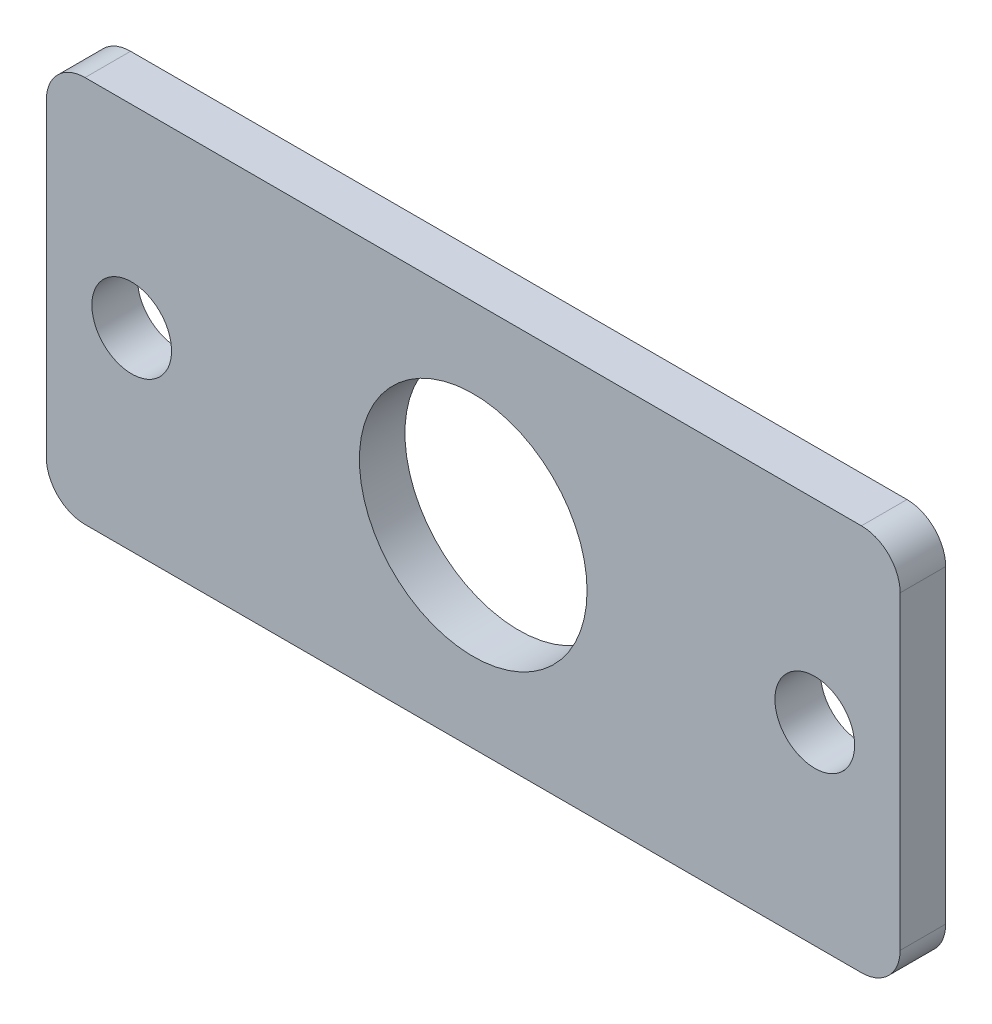
ISO-10303-21;
HEADER;
FILE_DESCRIPTION(('STEP AP214'),'2;1');
FILE_NAME('part.step','',(''),(''),'','','');
FILE_SCHEMA(('AUTOMOTIVE_DESIGN { 1 0 10303 214 1 1 1 1 }'));
ENDSEC;
DATA;
#1=APPLICATION_CONTEXT('core data for automotive mechanical design processes');
#2=APPLICATION_PROTOCOL_DEFINITION('international standard','automotive_design',2000,#1);
#3=PRODUCT_CONTEXT('',#1,'mechanical');
#4=PRODUCT('Part','Part','',(#3));
#5=PRODUCT_RELATED_PRODUCT_CATEGORY('part','',(#4));
#6=PRODUCT_DEFINITION_FORMATION('','',#4);
#7=PRODUCT_DEFINITION_CONTEXT('part definition',#1,'design');
#8=PRODUCT_DEFINITION('design','',#6,#7);
#9=PRODUCT_DEFINITION_SHAPE('','',#8);
#10=(LENGTH_UNIT() NAMED_UNIT(*) SI_UNIT(.MILLI.,.METRE.));
#11=(NAMED_UNIT(*) PLANE_ANGLE_UNIT() SI_UNIT($,.RADIAN.));
#12=(NAMED_UNIT(*) SI_UNIT($,.STERADIAN.) SOLID_ANGLE_UNIT());
#13=UNCERTAINTY_MEASURE_WITH_UNIT(LENGTH_MEASURE(1.E-05),#10,'distance_accuracy_value','');
#14=(GEOMETRIC_REPRESENTATION_CONTEXT(3) GLOBAL_UNCERTAINTY_ASSIGNED_CONTEXT((#13)) GLOBAL_UNIT_ASSIGNED_CONTEXT((#10,
#11,#12)) REPRESENTATION_CONTEXT('',''));
#15=CARTESIAN_POINT('',(0.,0.,0.));
#16=DIRECTION('',(0.,0.,1.));
#17=DIRECTION('',(1.,0.,0.));
#18=AXIS2_PLACEMENT_3D('',#15,#16,#17);
#19=CARTESIAN_POINT('',(37.5,-17.,4.));
#20=DIRECTION('',(-1.,0.,0.));
#21=DIRECTION('',(0.,0.,1.));
#22=AXIS2_PLACEMENT_3D('',#19,#20,#21);
#23=PLANE('',#22);
#24=DIRECTION('',(0.,1.,0.));
#25=VECTOR('',#24,1.);
#26=CARTESIAN_POINT('',(37.5,-17.,0.));
#27=LINE('',#26,#25);
#28=CARTESIAN_POINT('',(37.5,-13.6,0.));
#29=VERTEX_POINT('',#28);
#30=CARTESIAN_POINT('',(37.5,13.6,0.));
#31=VERTEX_POINT('',#30);
#32=EDGE_CURVE('E125',#29,#31,#27,.T.);
#33=ORIENTED_EDGE('',*,*,#32,.T.);
#34=DIRECTION('',(0.,0.,-1.));
#35=VECTOR('',#34,1.);
#36=CARTESIAN_POINT('',(37.5,13.6,4.));
#37=LINE('',#36,#35);
#38=CARTESIAN_POINT('',(37.5,13.6,4.));
#39=VERTEX_POINT('',#38);
#40=EDGE_CURVE('E103',#31,#39,#37,.F.);
#41=ORIENTED_EDGE('',*,*,#40,.T.);
#42=DIRECTION('',(0.,1.,0.));
#43=VECTOR('',#42,1.);
#44=CARTESIAN_POINT('',(37.5,-17.,4.));
#45=LINE('',#44,#43);
#46=CARTESIAN_POINT('',(37.5,-13.6,4.));
#47=VERTEX_POINT('',#46);
#48=EDGE_CURVE('E135',#47,#39,#45,.T.);
#49=ORIENTED_EDGE('',*,*,#48,.F.);
#50=DIRECTION('',(0.,0.,-1.));
#51=VECTOR('',#50,1.);
#52=CARTESIAN_POINT('',(37.5,-13.6,4.));
#53=LINE('',#52,#51);
#54=EDGE_CURVE('E108',#47,#29,#53,.T.);
#55=ORIENTED_EDGE('',*,*,#54,.T.);
#56=EDGE_LOOP('',(#33,#41,#49,#55));
#57=FACE_BOUND('',#56,.T.);
#58=ADVANCED_FACE('F32',(#57),#23,.F.);
#59=CARTESIAN_POINT('',(37.5,17.,4.));
#60=DIRECTION('',(0.,-1.,0.));
#61=DIRECTION('',(1.,0.,0.));
#62=AXIS2_PLACEMENT_3D('',#59,#60,#61);
#63=PLANE('',#62);
#64=DIRECTION('',(-1.,0.,0.));
#65=VECTOR('',#64,1.);
#66=CARTESIAN_POINT('',(37.5,17.,4.));
#67=LINE('',#66,#65);
#68=CARTESIAN_POINT('',(34.1,17.,4.));
#69=VERTEX_POINT('',#68);
#70=CARTESIAN_POINT('',(-34.1,17.,4.));
#71=VERTEX_POINT('',#70);
#72=EDGE_CURVE('E118',#69,#71,#67,.T.);
#73=ORIENTED_EDGE('',*,*,#72,.F.);
#74=DIRECTION('',(0.,0.,-1.));
#75=VECTOR('',#74,1.);
#76=CARTESIAN_POINT('',(34.1,17.,4.));
#77=LINE('',#76,#75);
#78=CARTESIAN_POINT('',(34.1,17.,0.));
#79=VERTEX_POINT('',#78);
#80=EDGE_CURVE('E102',#69,#79,#77,.T.);
#81=ORIENTED_EDGE('',*,*,#80,.T.);
#82=DIRECTION('',(-1.,0.,0.));
#83=VECTOR('',#82,1.);
#84=CARTESIAN_POINT('',(37.5,17.,0.));
#85=LINE('',#84,#83);
#86=CARTESIAN_POINT('',(-34.1,17.,0.));
#87=VERTEX_POINT('',#86);
#88=EDGE_CURVE('E115',#79,#87,#85,.T.);
#89=ORIENTED_EDGE('',*,*,#88,.T.);
#90=DIRECTION('',(0.,0.,-1.));
#91=VECTOR('',#90,1.);
#92=CARTESIAN_POINT('',(-34.1,17.,4.));
#93=LINE('',#92,#91);
#94=EDGE_CURVE('E120',#87,#71,#93,.F.);
#95=ORIENTED_EDGE('',*,*,#94,.T.);
#96=EDGE_LOOP('',(#73,#81,#89,#95));
#97=FACE_BOUND('',#96,.T.);
#98=ADVANCED_FACE('F114',(#97),#63,.F.);
#99=CARTESIAN_POINT('',(-37.5,-17.,4.));
#100=DIRECTION('',(1.,0.,0.));
#101=DIRECTION('',(0.,0.,-1.));
#102=AXIS2_PLACEMENT_3D('',#99,#100,#101);
#103=PLANE('',#102);
#104=DIRECTION('',(0.,-1.,0.));
#105=VECTOR('',#104,1.);
#106=CARTESIAN_POINT('',(-37.5,-17.,0.));
#107=LINE('',#106,#105);
#108=CARTESIAN_POINT('',(-37.5,13.6,0.));
#109=VERTEX_POINT('',#108);
#110=CARTESIAN_POINT('',(-37.5,-13.6,0.));
#111=VERTEX_POINT('',#110);
#112=EDGE_CURVE('E124',#109,#111,#107,.T.);
#113=ORIENTED_EDGE('',*,*,#112,.T.);
#114=DIRECTION('',(0.,0.,-1.));
#115=VECTOR('',#114,1.);
#116=CARTESIAN_POINT('',(-37.5,-13.6,4.));
#117=LINE('',#116,#115);
#118=CARTESIAN_POINT('',(-37.5,-13.6,4.));
#119=VERTEX_POINT('',#118);
#120=EDGE_CURVE('E11',#111,#119,#117,.F.);
#121=ORIENTED_EDGE('',*,*,#120,.T.);
#122=DIRECTION('',(0.,-1.,0.));
#123=VECTOR('',#122,1.);
#124=CARTESIAN_POINT('',(-37.5,-17.,4.));
#125=LINE('',#124,#123);
#126=CARTESIAN_POINT('',(-37.5,13.6,4.));
#127=VERTEX_POINT('',#126);
#128=EDGE_CURVE('E161',#127,#119,#125,.T.);
#129=ORIENTED_EDGE('',*,*,#128,.F.);
#130=DIRECTION('',(0.,0.,-1.));
#131=VECTOR('',#130,1.);
#132=CARTESIAN_POINT('',(-37.5,13.6,4.));
#133=LINE('',#132,#131);
#134=EDGE_CURVE('E40',#127,#109,#133,.T.);
#135=ORIENTED_EDGE('',*,*,#134,.T.);
#136=EDGE_LOOP('',(#113,#121,#129,#135));
#137=FACE_BOUND('',#136,.T.);
#138=ADVANCED_FACE('F159',(#137),#103,.F.);
#139=CARTESIAN_POINT('',(37.5,-17.,4.));
#140=DIRECTION('',(0.,1.,0.));
#141=DIRECTION('',(-1.,0.,0.));
#142=AXIS2_PLACEMENT_3D('',#139,#140,#141);
#143=PLANE('',#142);
#144=DIRECTION('',(1.,0.,0.));
#145=VECTOR('',#144,1.);
#146=CARTESIAN_POINT('',(37.5,-17.,0.));
#147=LINE('',#146,#145);
#148=CARTESIAN_POINT('',(-34.1,-17.,0.));
#149=VERTEX_POINT('',#148);
#150=CARTESIAN_POINT('',(34.1,-17.,0.));
#151=VERTEX_POINT('',#150);
#152=EDGE_CURVE('E128',#149,#151,#147,.T.);
#153=ORIENTED_EDGE('',*,*,#152,.T.);
#154=DIRECTION('',(0.,0.,-1.));
#155=VECTOR('',#154,1.);
#156=CARTESIAN_POINT('',(34.1,-17.,4.));
#157=LINE('',#156,#155);
#158=CARTESIAN_POINT('',(34.1,-17.,4.));
#159=VERTEX_POINT('',#158);
#160=EDGE_CURVE('E47',#151,#159,#157,.F.);
#161=ORIENTED_EDGE('',*,*,#160,.T.);
#162=DIRECTION('',(1.,0.,0.));
#163=VECTOR('',#162,1.);
#164=CARTESIAN_POINT('',(37.5,-17.,4.));
#165=LINE('',#164,#163);
#166=CARTESIAN_POINT('',(-34.1,-17.,4.));
#167=VERTEX_POINT('',#166);
#168=EDGE_CURVE('E136',#167,#159,#165,.T.);
#169=ORIENTED_EDGE('',*,*,#168,.F.);
#170=DIRECTION('',(0.,0.,-1.));
#171=VECTOR('',#170,1.);
#172=CARTESIAN_POINT('',(-34.1,-17.,4.));
#173=LINE('',#172,#171);
#174=EDGE_CURVE('E152',#167,#149,#173,.T.);
#175=ORIENTED_EDGE('',*,*,#174,.T.);
#176=EDGE_LOOP('',(#153,#161,#169,#175));
#177=FACE_BOUND('',#176,.T.);
#178=ADVANCED_FACE('F168',(#177),#143,.F.);
#179=CARTESIAN_POINT('',(37.5,17.,4.));
#180=DIRECTION('',(0.,0.,1.));
#181=DIRECTION('',(1.,0.,0.));
#182=AXIS2_PLACEMENT_3D('',#179,#180,#181);
#183=PLANE('',#182);
#184=CARTESIAN_POINT('',(-30.,-1.2245106889248E-13,4.));
#185=DIRECTION('',(0.,0.,1.));
#186=DIRECTION('',(-1.,0.,0.));
#187=AXIS2_PLACEMENT_3D('',#184,#185,#186);
#188=CIRCLE('',#187,3.5);
#189=CARTESIAN_POINT('',(-33.5,-1.2245106889248E-13,4.));
#190=VERTEX_POINT('',#189);
#191=EDGE_CURVE('E187',#190,#190,#188,.T.);
#192=ORIENTED_EDGE('',*,*,#191,.F.);
#193=EDGE_LOOP('',(#192));
#194=FACE_BOUND('',#193,.T.);
#195=CARTESIAN_POINT('',(30.,0.,4.));
#196=DIRECTION('',(0.,0.,1.));
#197=DIRECTION('',(1.,0.,0.));
#198=AXIS2_PLACEMENT_3D('',#195,#196,#197);
#199=CIRCLE('',#198,3.5);
#200=CARTESIAN_POINT('',(33.5,0.,4.));
#201=VERTEX_POINT('',#200);
#202=EDGE_CURVE('E181',#201,#201,#199,.T.);
#203=ORIENTED_EDGE('',*,*,#202,.F.);
#204=EDGE_LOOP('',(#203));
#205=FACE_BOUND('',#204,.T.);
#206=CARTESIAN_POINT('',(0.,0.,4.));
#207=DIRECTION('',(0.,0.,1.));
#208=DIRECTION('',(1.,0.,0.));
#209=AXIS2_PLACEMENT_3D('',#206,#207,#208);
#210=CIRCLE('',#209,10.);
#211=CARTESIAN_POINT('',(10.,0.,4.));
#212=VERTEX_POINT('',#211);
#213=EDGE_CURVE('E175',#212,#212,#210,.T.);
#214=ORIENTED_EDGE('',*,*,#213,.F.);
#215=EDGE_LOOP('',(#214));
#216=FACE_BOUND('',#215,.T.);
#217=ORIENTED_EDGE('',*,*,#48,.T.);
#218=CARTESIAN_POINT('',(34.1,13.6,4.));
#219=DIRECTION('',(0.,0.,1.));
#220=DIRECTION('',(1.,0.,0.));
#221=AXIS2_PLACEMENT_3D('',#218,#219,#220);
#222=CIRCLE('',#221,3.4);
#223=EDGE_CURVE('E150',#39,#69,#222,.T.);
#224=ORIENTED_EDGE('',*,*,#223,.T.);
#225=ORIENTED_EDGE('',*,*,#72,.T.);
#226=CARTESIAN_POINT('',(-34.1,13.6,4.));
#227=DIRECTION('',(0.,0.,1.));
#228=DIRECTION('',(1.,0.,0.));
#229=AXIS2_PLACEMENT_3D('',#226,#227,#228);
#230=CIRCLE('',#229,3.4);
#231=EDGE_CURVE('E145',#71,#127,#230,.T.);
#232=ORIENTED_EDGE('',*,*,#231,.T.);
#233=ORIENTED_EDGE('',*,*,#128,.T.);
#234=CARTESIAN_POINT('',(-34.1,-13.6,4.));
#235=DIRECTION('',(0.,0.,1.));
#236=DIRECTION('',(1.,0.,0.));
#237=AXIS2_PLACEMENT_3D('',#234,#235,#236);
#238=CIRCLE('',#237,3.4);
#239=EDGE_CURVE('E54',#119,#167,#238,.T.);
#240=ORIENTED_EDGE('',*,*,#239,.T.);
#241=ORIENTED_EDGE('',*,*,#168,.T.);
#242=CARTESIAN_POINT('',(34.1,-13.6,4.));
#243=DIRECTION('',(0.,0.,1.));
#244=DIRECTION('',(1.,0.,0.));
#245=AXIS2_PLACEMENT_3D('',#242,#243,#244);
#246=CIRCLE('',#245,3.4);
#247=EDGE_CURVE('E148',#159,#47,#246,.T.);
#248=ORIENTED_EDGE('',*,*,#247,.T.);
#249=EDGE_LOOP('',(#217,#224,#225,#232,#233,#240,#241,#248));
#250=FACE_BOUND('',#249,.T.);
#251=ADVANCED_FACE('F202',(#194,#205,#216,#250),#183,.T.);
#252=CARTESIAN_POINT('',(37.5,17.,0.));
#253=DIRECTION('',(0.,0.,1.));
#254=DIRECTION('',(1.,0.,0.));
#255=AXIS2_PLACEMENT_3D('',#252,#253,#254);
#256=PLANE('',#255);
#257=CARTESIAN_POINT('',(-30.,-1.2245106889248E-13,0.));
#258=DIRECTION('',(0.,0.,1.));
#259=DIRECTION('',(-1.,0.,0.));
#260=AXIS2_PLACEMENT_3D('',#257,#258,#259);
#261=CIRCLE('',#260,3.5);
#262=CARTESIAN_POINT('',(-33.5,-1.2245106889248E-13,0.));
#263=VERTEX_POINT('',#262);
#264=EDGE_CURVE('E184',#263,#263,#261,.T.);
#265=ORIENTED_EDGE('',*,*,#264,.T.);
#266=EDGE_LOOP('',(#265));
#267=FACE_BOUND('',#266,.T.);
#268=CARTESIAN_POINT('',(30.,0.,0.));
#269=DIRECTION('',(0.,0.,1.));
#270=DIRECTION('',(1.,0.,0.));
#271=AXIS2_PLACEMENT_3D('',#268,#269,#270);
#272=CIRCLE('',#271,3.5);
#273=CARTESIAN_POINT('',(33.5,0.,0.));
#274=VERTEX_POINT('',#273);
#275=EDGE_CURVE('E178',#274,#274,#272,.T.);
#276=ORIENTED_EDGE('',*,*,#275,.T.);
#277=EDGE_LOOP('',(#276));
#278=FACE_BOUND('',#277,.T.);
#279=CARTESIAN_POINT('',(0.,0.,0.));
#280=DIRECTION('',(0.,0.,1.));
#281=DIRECTION('',(1.,0.,0.));
#282=AXIS2_PLACEMENT_3D('',#279,#280,#281);
#283=CIRCLE('',#282,10.);
#284=CARTESIAN_POINT('',(10.,0.,0.));
#285=VERTEX_POINT('',#284);
#286=EDGE_CURVE('E130',#285,#285,#283,.T.);
#287=ORIENTED_EDGE('',*,*,#286,.T.);
#288=EDGE_LOOP('',(#287));
#289=FACE_BOUND('',#288,.T.);
#290=ORIENTED_EDGE('',*,*,#88,.F.);
#291=CARTESIAN_POINT('',(34.1,13.6,0.));
#292=DIRECTION('',(0.,0.,1.));
#293=DIRECTION('',(1.,0.,0.));
#294=AXIS2_PLACEMENT_3D('',#291,#292,#293);
#295=CIRCLE('',#294,3.4);
#296=EDGE_CURVE('E98',#79,#31,#295,.F.);
#297=ORIENTED_EDGE('',*,*,#296,.T.);
#298=ORIENTED_EDGE('',*,*,#32,.F.);
#299=CARTESIAN_POINT('',(34.1,-13.6,0.));
#300=DIRECTION('',(0.,0.,1.));
#301=DIRECTION('',(1.,0.,0.));
#302=AXIS2_PLACEMENT_3D('',#299,#300,#301);
#303=CIRCLE('',#302,3.4);
#304=EDGE_CURVE('E109',#29,#151,#303,.F.);
#305=ORIENTED_EDGE('',*,*,#304,.T.);
#306=ORIENTED_EDGE('',*,*,#152,.F.);
#307=CARTESIAN_POINT('',(-34.1,-13.6,0.));
#308=DIRECTION('',(0.,0.,1.));
#309=DIRECTION('',(1.,0.,0.));
#310=AXIS2_PLACEMENT_3D('',#307,#308,#309);
#311=CIRCLE('',#310,3.4);
#312=EDGE_CURVE('E139',#149,#111,#311,.F.);
#313=ORIENTED_EDGE('',*,*,#312,.T.);
#314=ORIENTED_EDGE('',*,*,#112,.F.);
#315=CARTESIAN_POINT('',(-34.1,13.6,0.));
#316=DIRECTION('',(0.,0.,1.));
#317=DIRECTION('',(1.,0.,0.));
#318=AXIS2_PLACEMENT_3D('',#315,#316,#317);
#319=CIRCLE('',#318,3.4);
#320=EDGE_CURVE('E119',#109,#87,#319,.F.);
#321=ORIENTED_EDGE('',*,*,#320,.T.);
#322=EDGE_LOOP('',(#290,#297,#298,#305,#306,#313,#314,#321));
#323=FACE_BOUND('',#322,.T.);
#324=ADVANCED_FACE('F122',(#267,#278,#289,#323),#256,.F.);
#325=CARTESIAN_POINT('',(0.,0.,0.));
#326=DIRECTION('',(0.,0.,1.));
#327=DIRECTION('',(1.,0.,0.));
#328=AXIS2_PLACEMENT_3D('',#325,#326,#327);
#329=CYLINDRICAL_SURFACE('',#328,10.);
#330=ORIENTED_EDGE('',*,*,#286,.F.);
#331=EDGE_LOOP('',(#330));
#332=FACE_BOUND('',#331,.T.);
#333=ORIENTED_EDGE('',*,*,#213,.T.);
#334=EDGE_LOOP('',(#333));
#335=FACE_BOUND('',#334,.T.);
#336=ADVANCED_FACE('F220',(#332,#335),#329,.F.);
#337=CARTESIAN_POINT('',(34.1,13.6,4.));
#338=DIRECTION('',(0.,0.,-1.));
#339=DIRECTION('',(-1.,0.,0.));
#340=AXIS2_PLACEMENT_3D('',#337,#338,#339);
#341=CYLINDRICAL_SURFACE('',#340,3.4);
#342=ORIENTED_EDGE('',*,*,#223,.F.);
#343=ORIENTED_EDGE('',*,*,#40,.F.);
#344=ORIENTED_EDGE('',*,*,#296,.F.);
#345=ORIENTED_EDGE('',*,*,#80,.F.);
#346=EDGE_LOOP('',(#342,#343,#344,#345));
#347=FACE_BOUND('',#346,.T.);
#348=ADVANCED_FACE('F101',(#347),#341,.T.);
#349=CARTESIAN_POINT('',(34.1,-13.6,4.));
#350=DIRECTION('',(0.,0.,-1.));
#351=DIRECTION('',(-1.,0.,0.));
#352=AXIS2_PLACEMENT_3D('',#349,#350,#351);
#353=CYLINDRICAL_SURFACE('',#352,3.4);
#354=ORIENTED_EDGE('',*,*,#247,.F.);
#355=ORIENTED_EDGE('',*,*,#160,.F.);
#356=ORIENTED_EDGE('',*,*,#304,.F.);
#357=ORIENTED_EDGE('',*,*,#54,.F.);
#358=EDGE_LOOP('',(#354,#355,#356,#357));
#359=FACE_BOUND('',#358,.T.);
#360=ADVANCED_FACE('F213',(#359),#353,.T.);
#361=CARTESIAN_POINT('',(-34.1,-13.6,4.));
#362=DIRECTION('',(0.,0.,-1.));
#363=DIRECTION('',(-1.,0.,0.));
#364=AXIS2_PLACEMENT_3D('',#361,#362,#363);
#365=CYLINDRICAL_SURFACE('',#364,3.4);
#366=ORIENTED_EDGE('',*,*,#239,.F.);
#367=ORIENTED_EDGE('',*,*,#120,.F.);
#368=ORIENTED_EDGE('',*,*,#312,.F.);
#369=ORIENTED_EDGE('',*,*,#174,.F.);
#370=EDGE_LOOP('',(#366,#367,#368,#369));
#371=FACE_BOUND('',#370,.T.);
#372=ADVANCED_FACE('F167',(#371),#365,.T.);
#373=CARTESIAN_POINT('',(-34.1,13.6,4.));
#374=DIRECTION('',(0.,0.,-1.));
#375=DIRECTION('',(-1.,0.,0.));
#376=AXIS2_PLACEMENT_3D('',#373,#374,#375);
#377=CYLINDRICAL_SURFACE('',#376,3.4);
#378=ORIENTED_EDGE('',*,*,#231,.F.);
#379=ORIENTED_EDGE('',*,*,#94,.F.);
#380=ORIENTED_EDGE('',*,*,#320,.F.);
#381=ORIENTED_EDGE('',*,*,#134,.F.);
#382=EDGE_LOOP('',(#378,#379,#380,#381));
#383=FACE_BOUND('',#382,.T.);
#384=ADVANCED_FACE('F34',(#383),#377,.T.);
#385=CARTESIAN_POINT('',(30.,0.,0.));
#386=DIRECTION('',(0.,0.,1.));
#387=DIRECTION('',(1.,0.,0.));
#388=AXIS2_PLACEMENT_3D('',#385,#386,#387);
#389=CYLINDRICAL_SURFACE('',#388,3.5);
#390=ORIENTED_EDGE('',*,*,#275,.F.);
#391=EDGE_LOOP('',(#390));
#392=FACE_BOUND('',#391,.T.);
#393=ORIENTED_EDGE('',*,*,#202,.T.);
#394=EDGE_LOOP('',(#393));
#395=FACE_BOUND('',#394,.T.);
#396=ADVANCED_FACE('F198',(#392,#395),#389,.F.);
#397=CARTESIAN_POINT('',(-30.,-1.2245106889248E-13,0.));
#398=DIRECTION('',(0.,0.,1.));
#399=DIRECTION('',(1.,0.,0.));
#400=AXIS2_PLACEMENT_3D('',#397,#398,#399);
#401=CYLINDRICAL_SURFACE('',#400,3.5);
#402=ORIENTED_EDGE('',*,*,#264,.F.);
#403=EDGE_LOOP('',(#402));
#404=FACE_BOUND('',#403,.T.);
#405=ORIENTED_EDGE('',*,*,#191,.T.);
#406=EDGE_LOOP('',(#405));
#407=FACE_BOUND('',#406,.T.);
#408=ADVANCED_FACE('F195',(#404,#407),#401,.F.);
#409=CLOSED_SHELL('',(#58,#98,#138,#178,#251,#324,#336,#348,#360,#372,#384,#396,#408));
#410=MANIFOLD_SOLID_BREP('B2',#409);
#411=ADVANCED_BREP_SHAPE_REPRESENTATION('',(#18,#410),#14);
#412=SHAPE_DEFINITION_REPRESENTATION(#9,#411);
ENDSEC;
END-ISO-10303-21;
